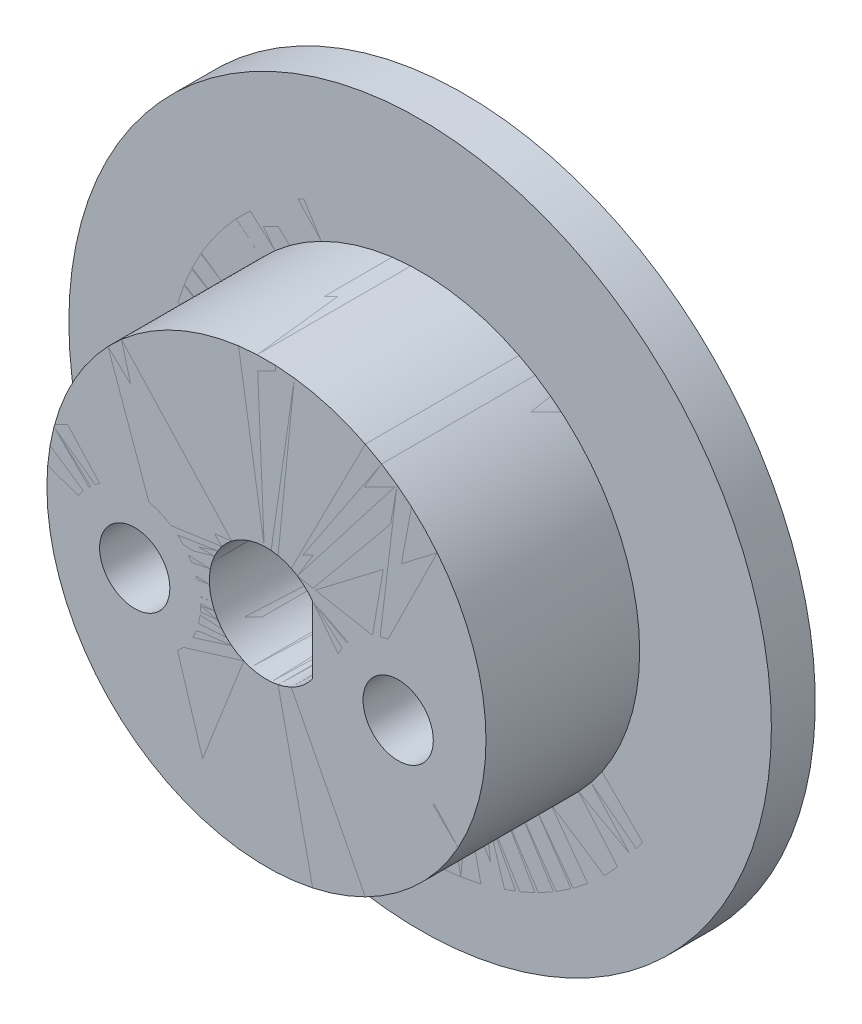
ISO-10303-21;
HEADER;
FILE_DESCRIPTION(('STEP AP214'),'2;1');
FILE_NAME('part.step','',(''),(''),'','','');
FILE_SCHEMA(('AUTOMOTIVE_DESIGN { 1 0 10303 214 1 1 1 1 }'));
ENDSEC;
DATA;
#1=APPLICATION_CONTEXT('core data for automotive mechanical design processes');
#2=APPLICATION_PROTOCOL_DEFINITION('international standard','automotive_design',2000,#1);
#3=PRODUCT_CONTEXT('',#1,'mechanical');
#4=PRODUCT('Part','Part','',(#3));
#5=PRODUCT_RELATED_PRODUCT_CATEGORY('part','',(#4));
#6=PRODUCT_DEFINITION_FORMATION('','',#4);
#7=PRODUCT_DEFINITION_CONTEXT('part definition',#1,'design');
#8=PRODUCT_DEFINITION('design','',#6,#7);
#9=PRODUCT_DEFINITION_SHAPE('','',#8);
#10=(LENGTH_UNIT() NAMED_UNIT(*) SI_UNIT(.MILLI.,.METRE.));
#11=(NAMED_UNIT(*) PLANE_ANGLE_UNIT() SI_UNIT($,.RADIAN.));
#12=(NAMED_UNIT(*) SI_UNIT($,.STERADIAN.) SOLID_ANGLE_UNIT());
#13=UNCERTAINTY_MEASURE_WITH_UNIT(LENGTH_MEASURE(1.E-05),#10,'distance_accuracy_value','');
#14=(GEOMETRIC_REPRESENTATION_CONTEXT(3) GLOBAL_UNCERTAINTY_ASSIGNED_CONTEXT((#13)) GLOBAL_UNIT_ASSIGNED_CONTEXT((#10,
#11,#12)) REPRESENTATION_CONTEXT('',''));
#15=CARTESIAN_POINT('',(0.,0.,0.));
#16=DIRECTION('',(0.,0.,1.));
#17=DIRECTION('',(1.,0.,0.));
#18=AXIS2_PLACEMENT_3D('',#15,#16,#17);
#19=CARTESIAN_POINT('',(0.,0.,18.));
#20=DIRECTION('',(0.,0.,1.));
#21=DIRECTION('',(1.,0.,0.));
#22=AXIS2_PLACEMENT_3D('',#19,#20,#21);
#23=PLANE('',#22);
#24=CARTESIAN_POINT('',(6.,-1.21,18.));
#25=DIRECTION('',(0.,0.,1.));
#26=DIRECTION('',(1.,0.,0.));
#27=AXIS2_PLACEMENT_3D('',#24,#25,#26);
#28=CIRCLE('',#27,3.);
#29=CARTESIAN_POINT('',(9.,-1.21,18.));
#30=VERTEX_POINT('',#29);
#31=EDGE_CURVE('P0_E55',#30,#30,#28,.F.);
#32=ORIENTED_EDGE('',*,*,#31,.T.);
#33=EDGE_LOOP('',(#32));
#34=FACE_BOUND('',#33,.T.);
#35=CARTESIAN_POINT('',(-6.,-1.21,18.));
#36=DIRECTION('',(0.,0.,1.));
#37=DIRECTION('',(1.,0.,0.));
#38=AXIS2_PLACEMENT_3D('',#35,#36,#37);
#39=CIRCLE('',#38,3.);
#40=CARTESIAN_POINT('',(-3.,-1.21,18.));
#41=VERTEX_POINT('',#40);
#42=EDGE_CURVE('P0_E122',#41,#41,#39,.F.);
#43=ORIENTED_EDGE('',*,*,#42,.T.);
#44=EDGE_LOOP('',(#43));
#45=FACE_BOUND('',#44,.T.);
#46=CARTESIAN_POINT('',(-1.59872115546023E-13,-2.8421709430404E-13,18.));
#47=DIRECTION('',(0.,0.,-1.));
#48=DIRECTION('',(-1.,0.,0.));
#49=AXIS2_PLACEMENT_3D('',#46,#47,#48);
#50=CIRCLE('',#49,2.6);
#51=CARTESIAN_POINT('',(2.09999999999983,-1.53297097167589,18.));
#52=VERTEX_POINT('',#51);
#53=CARTESIAN_POINT('',(2.09999999999983,1.53297097167532,18.));
#54=VERTEX_POINT('',#53);
#55=EDGE_CURVE('P0_E85',#52,#54,#50,.T.);
#56=ORIENTED_EDGE('',*,*,#55,.T.);
#57=DIRECTION('',(0.,1.,0.));
#58=VECTOR('',#57,1.);
#59=CARTESIAN_POINT('',(2.09999999999983,0.,18.));
#60=LINE('',#59,#58);
#61=EDGE_CURVE('P0_E93',#54,#52,#60,.F.);
#62=ORIENTED_EDGE('',*,*,#61,.T.);
#63=EDGE_LOOP('',(#56,#62));
#64=FACE_BOUND('',#63,.T.);
#65=CARTESIAN_POINT('',(0.,0.,18.));
#66=DIRECTION('',(0.,0.,1.));
#67=DIRECTION('',(-1.,0.,0.));
#68=AXIS2_PLACEMENT_3D('',#65,#66,#67);
#69=CIRCLE('',#68,10.);
#70=CARTESIAN_POINT('',(10.,0.,18.));
#71=VERTEX_POINT('',#70);
#72=EDGE_CURVE('P0_E153',#71,#71,#69,.T.);
#73=ORIENTED_EDGE('',*,*,#72,.T.);
#74=EDGE_LOOP('',(#73));
#75=FACE_BOUND('',#74,.T.);
#76=ADVANCED_FACE('P0_F45',(#34,#45,#64,#75),#23,.T.);
#77=CARTESIAN_POINT('',(0.,0.,11.));
#78=DIRECTION('',(0.,0.,1.));
#79=DIRECTION('',(-1.,0.,0.));
#80=AXIS2_PLACEMENT_3D('',#77,#78,#79);
#81=CYLINDRICAL_SURFACE('',#80,10.);
#82=ORIENTED_EDGE('',*,*,#72,.F.);
#83=DIRECTION('',(0.,0.,-1.));
#84=VECTOR('',#83,1.);
#85=CARTESIAN_POINT('',(10.,0.,11.));
#86=LINE('',#85,#84);
#87=CARTESIAN_POINT('',(10.,0.,11.));
#88=VERTEX_POINT('',#87);
#89=EDGE_CURVE('P0_E67',#71,#88,#86,.T.);
#90=ORIENTED_EDGE('',*,*,#89,.T.);
#91=CARTESIAN_POINT('',(0.,0.,11.));
#92=DIRECTION('',(0.,0.,-1.));
#93=DIRECTION('',(-1.,0.,0.));
#94=AXIS2_PLACEMENT_3D('',#91,#92,#93);
#95=CIRCLE('',#94,10.);
#96=EDGE_CURVE('P0_E96',#88,#88,#95,.T.);
#97=ORIENTED_EDGE('',*,*,#96,.F.);
#98=ORIENTED_EDGE('',*,*,#89,.F.);
#99=EDGE_LOOP('',(#82,#90,#97,#98));
#100=FACE_BOUND('',#99,.T.);
#101=ADVANCED_FACE('P0_F163',(#100),#81,.T.);
#102=CARTESIAN_POINT('',(0.,0.,9.));
#103=DIRECTION('',(0.,0.,1.));
#104=DIRECTION('',(1.,0.,0.));
#105=AXIS2_PLACEMENT_3D('',#102,#103,#104);
#106=PLANE('',#105);
#107=CARTESIAN_POINT('',(-6.,-1.21,9.));
#108=DIRECTION('',(0.,0.,1.));
#109=DIRECTION('',(1.,0.,0.));
#110=AXIS2_PLACEMENT_3D('',#107,#108,#109);
#111=CIRCLE('',#110,2.);
#112=CARTESIAN_POINT('',(-4.,-1.21,9.));
#113=VERTEX_POINT('',#112);
#114=EDGE_CURVE('P0_E143',#113,#113,#111,.T.);
#115=ORIENTED_EDGE('',*,*,#114,.T.);
#116=EDGE_LOOP('',(#115));
#117=FACE_BOUND('',#116,.T.);
#118=CARTESIAN_POINT('',(6.,-1.21,9.));
#119=DIRECTION('',(0.,0.,1.));
#120=DIRECTION('',(1.,0.,0.));
#121=AXIS2_PLACEMENT_3D('',#118,#119,#120);
#122=CIRCLE('',#121,2.);
#123=CARTESIAN_POINT('',(8.,-1.21,9.));
#124=VERTEX_POINT('',#123);
#125=EDGE_CURVE('P0_E141',#124,#124,#122,.T.);
#126=ORIENTED_EDGE('',*,*,#125,.T.);
#127=EDGE_LOOP('',(#126));
#128=FACE_BOUND('',#127,.T.);
#129=CARTESIAN_POINT('',(-1.5487611193521E-13,-2.81469292318093E-13,9.));
#130=DIRECTION('',(0.,0.,1.));
#131=DIRECTION('',(-1.,0.,0.));
#132=AXIS2_PLACEMENT_3D('',#129,#130,#131);
#133=CIRCLE('',#132,2.6);
#134=CARTESIAN_POINT('',(2.09999999999984,1.53297097167533,9.));
#135=VERTEX_POINT('',#134);
#136=CARTESIAN_POINT('',(2.09999999999984,-1.5329709716759,9.));
#137=VERTEX_POINT('',#136);
#138=EDGE_CURVE('P0_E97',#135,#137,#133,.T.);
#139=ORIENTED_EDGE('',*,*,#138,.T.);
#140=DIRECTION('',(0.,1.,0.));
#141=VECTOR('',#140,1.);
#142=CARTESIAN_POINT('',(2.09999999999984,0.766485485837665,9.));
#143=LINE('',#142,#141);
#144=EDGE_CURVE('P0_E116',#137,#135,#143,.T.);
#145=ORIENTED_EDGE('',*,*,#144,.T.);
#146=EDGE_LOOP('',(#139,#145));
#147=FACE_BOUND('',#146,.T.);
#148=CARTESIAN_POINT('',(0.,0.,9.));
#149=DIRECTION('',(0.,0.,-1.));
#150=DIRECTION('',(-1.,0.,0.));
#151=AXIS2_PLACEMENT_3D('',#148,#149,#150);
#152=CIRCLE('',#151,16.);
#153=CARTESIAN_POINT('',(-16.,0.,9.));
#154=VERTEX_POINT('',#153);
#155=EDGE_CURVE('P0_E144',#154,#154,#152,.T.);
#156=ORIENTED_EDGE('',*,*,#155,.T.);
#157=EDGE_LOOP('',(#156));
#158=FACE_BOUND('',#157,.T.);
#159=ADVANCED_FACE('P0_F168',(#117,#128,#147,#158),#106,.F.);
#160=CARTESIAN_POINT('',(0.,0.,11.));
#161=DIRECTION('',(0.,0.,1.));
#162=DIRECTION('',(1.,0.,0.));
#163=AXIS2_PLACEMENT_3D('',#160,#161,#162);
#164=PLANE('',#163);
#165=ORIENTED_EDGE('',*,*,#96,.T.);
#166=EDGE_LOOP('',(#165));
#167=FACE_BOUND('',#166,.T.);
#168=CARTESIAN_POINT('',(0.,0.,11.));
#169=DIRECTION('',(0.,0.,1.));
#170=DIRECTION('',(1.,0.,0.));
#171=AXIS2_PLACEMENT_3D('',#168,#169,#170);
#172=CIRCLE('',#171,16.);
#173=CARTESIAN_POINT('',(16.,0.,11.));
#174=VERTEX_POINT('',#173);
#175=EDGE_CURVE('P0_E149',#174,#174,#172,.F.);
#176=ORIENTED_EDGE('',*,*,#175,.F.);
#177=EDGE_LOOP('',(#176));
#178=FACE_BOUND('',#177,.T.);
#179=ADVANCED_FACE('P0_F165',(#167,#178),#164,.T.);
#180=CARTESIAN_POINT('',(-1.59872115546023E-13,-2.8421709430404E-13,17.9999999999996));
#181=DIRECTION('',(0.,0.,-1.));
#182=DIRECTION('',(-1.,0.,0.));
#183=AXIS2_PLACEMENT_3D('',#180,#181,#182);
#184=CYLINDRICAL_SURFACE('',#183,2.6);
#185=DIRECTION('',(0.,0.,-1.));
#186=VECTOR('',#185,1.);
#187=CARTESIAN_POINT('',(2.09999999999983,-1.5329709716759,17.9999999999996));
#188=LINE('',#187,#186);
#189=EDGE_CURVE('P0_E109',#52,#137,#188,.T.);
#190=ORIENTED_EDGE('',*,*,#189,.T.);
#191=ORIENTED_EDGE('',*,*,#138,.F.);
#192=DIRECTION('',(0.,0.,-1.));
#193=VECTOR('',#192,1.);
#194=CARTESIAN_POINT('',(2.09999999999983,1.53297097167533,17.9999999999996));
#195=LINE('',#194,#193);
#196=EDGE_CURVE('P0_E100',#54,#135,#195,.T.);
#197=ORIENTED_EDGE('',*,*,#196,.F.);
#198=ORIENTED_EDGE('',*,*,#55,.F.);
#199=EDGE_LOOP('',(#190,#191,#197,#198));
#200=FACE_BOUND('',#199,.T.);
#201=ADVANCED_FACE('P0_F101',(#200),#184,.F.);
#202=CARTESIAN_POINT('',(2.09999999999983,1.53297097167533,17.9999999999996));
#203=DIRECTION('',(1.,0.,0.));
#204=DIRECTION('',(0.,0.,1.));
#205=AXIS2_PLACEMENT_3D('',#202,#203,#204);
#206=PLANE('',#205);
#207=ORIENTED_EDGE('',*,*,#196,.T.);
#208=ORIENTED_EDGE('',*,*,#144,.F.);
#209=ORIENTED_EDGE('',*,*,#189,.F.);
#210=ORIENTED_EDGE('',*,*,#61,.F.);
#211=EDGE_LOOP('',(#207,#208,#209,#210));
#212=FACE_BOUND('',#211,.T.);
#213=ADVANCED_FACE('P0_F108',(#212),#206,.F.);
#214=CARTESIAN_POINT('',(6.,-1.21,9.));
#215=DIRECTION('',(0.,0.,1.));
#216=DIRECTION('',(1.,0.,0.));
#217=AXIS2_PLACEMENT_3D('',#214,#215,#216);
#218=CYLINDRICAL_SURFACE('',#217,2.);
#219=CARTESIAN_POINT('',(6.,-1.21,17.));
#220=DIRECTION('',(0.,0.,1.));
#221=DIRECTION('',(1.,0.,0.));
#222=AXIS2_PLACEMENT_3D('',#219,#220,#221);
#223=CIRCLE('',#222,2.);
#224=CARTESIAN_POINT('',(8.,-1.21,17.));
#225=VERTEX_POINT('',#224);
#226=EDGE_CURVE('P0_E119',#225,#225,#223,.T.);
#227=ORIENTED_EDGE('',*,*,#226,.T.);
#228=EDGE_LOOP('',(#227));
#229=FACE_BOUND('',#228,.T.);
#230=ORIENTED_EDGE('',*,*,#125,.F.);
#231=EDGE_LOOP('',(#230));
#232=FACE_BOUND('',#231,.T.);
#233=ADVANCED_FACE('P0_F135',(#229,#232),#218,.F.);
#234=CARTESIAN_POINT('',(-6.,-1.21,9.));
#235=DIRECTION('',(0.,0.,1.));
#236=DIRECTION('',(1.,0.,0.));
#237=AXIS2_PLACEMENT_3D('',#234,#235,#236);
#238=CYLINDRICAL_SURFACE('',#237,2.);
#239=CARTESIAN_POINT('',(-6.,-1.21,17.));
#240=DIRECTION('',(0.,0.,1.));
#241=DIRECTION('',(1.,0.,0.));
#242=AXIS2_PLACEMENT_3D('',#239,#240,#241);
#243=CIRCLE('',#242,2.);
#244=CARTESIAN_POINT('',(-4.,-1.21,17.));
#245=VERTEX_POINT('',#244);
#246=EDGE_CURVE('P0_E11',#245,#245,#243,.T.);
#247=ORIENTED_EDGE('',*,*,#246,.T.);
#248=EDGE_LOOP('',(#247));
#249=FACE_BOUND('',#248,.T.);
#250=ORIENTED_EDGE('',*,*,#114,.F.);
#251=EDGE_LOOP('',(#250));
#252=FACE_BOUND('',#251,.T.);
#253=ADVANCED_FACE('P0_F132',(#249,#252),#238,.F.);
#254=CARTESIAN_POINT('',(6.,-1.21,17.));
#255=DIRECTION('',(0.,0.,1.));
#256=DIRECTION('',(1.,0.,0.));
#257=AXIS2_PLACEMENT_3D('',#254,#255,#256);
#258=CONICAL_SURFACE('',#257,2.,0.785398163397449);
#259=ORIENTED_EDGE('',*,*,#31,.F.);
#260=EDGE_LOOP('',(#259));
#261=FACE_BOUND('',#260,.T.);
#262=ORIENTED_EDGE('',*,*,#226,.F.);
#263=EDGE_LOOP('',(#262));
#264=FACE_BOUND('',#263,.T.);
#265=ADVANCED_FACE('P0_F129',(#261,#264),#258,.F.);
#266=CARTESIAN_POINT('',(-6.,-1.21,17.));
#267=DIRECTION('',(0.,0.,1.));
#268=DIRECTION('',(1.,0.,0.));
#269=AXIS2_PLACEMENT_3D('',#266,#267,#268);
#270=CONICAL_SURFACE('',#269,2.,0.785398163397451);
#271=ORIENTED_EDGE('',*,*,#42,.F.);
#272=EDGE_LOOP('',(#271));
#273=FACE_BOUND('',#272,.T.);
#274=ORIENTED_EDGE('',*,*,#246,.F.);
#275=EDGE_LOOP('',(#274));
#276=FACE_BOUND('',#275,.T.);
#277=ADVANCED_FACE('P0_F48',(#273,#276),#270,.F.);
#278=CARTESIAN_POINT('',(0.,0.,56.254833995939));
#279=DIRECTION('',(0.,0.,-1.));
#280=DIRECTION('',(-1.,0.,0.));
#281=AXIS2_PLACEMENT_3D('',#278,#279,#280);
#282=CYLINDRICAL_SURFACE('',#281,16.);
#283=ORIENTED_EDGE('',*,*,#155,.F.);
#284=EDGE_LOOP('',(#283));
#285=FACE_BOUND('',#284,.T.);
#286=ORIENTED_EDGE('',*,*,#175,.T.);
#287=EDGE_LOOP('',(#286));
#288=FACE_BOUND('',#287,.T.);
#289=ADVANCED_FACE('P0_F173',(#285,#288),#282,.T.);
#290=CLOSED_SHELL('',(#76,#101,#159,#179,#201,#213,#233,#253,#265,#277,#289));
#291=MANIFOLD_SOLID_BREP('P0_B2',#290);
#292=CARTESIAN_POINT('',(0.,0.,18.));
#293=DIRECTION('',(0.,0.,1.));
#294=DIRECTION('',(1.,0.,0.));
#295=AXIS2_PLACEMENT_3D('',#292,#293,#294);
#296=PLANE('',#295);
#297=CARTESIAN_POINT('',(-6.,-1.21,18.));
#298=DIRECTION('',(0.,0.,-1.));
#299=DIRECTION('',(-1.,0.,0.));
#300=AXIS2_PLACEMENT_3D('',#297,#298,#299);
#301=CIRCLE('',#300,1.6);
#302=CARTESIAN_POINT('',(-4.4,-1.21,18.));
#303=VERTEX_POINT('',#302);
#304=EDGE_CURVE('P1_E19',#303,#303,#301,.T.);
#305=ORIENTED_EDGE('',*,*,#304,.T.);
#306=EDGE_LOOP('',(#305));
#307=FACE_BOUND('',#306,.T.);
#308=CARTESIAN_POINT('',(6.,-1.21,18.));
#309=DIRECTION('',(0.,0.,-1.));
#310=DIRECTION('',(-1.,0.,0.));
#311=AXIS2_PLACEMENT_3D('',#308,#309,#310);
#312=CIRCLE('',#311,1.6);
#313=CARTESIAN_POINT('',(7.6,-1.21,18.));
#314=VERTEX_POINT('',#313);
#315=EDGE_CURVE('P1_E151',#314,#314,#312,.T.);
#316=ORIENTED_EDGE('',*,*,#315,.T.);
#317=EDGE_LOOP('',(#316));
#318=FACE_BOUND('',#317,.T.);
#319=CARTESIAN_POINT('',(-1.59872115546023E-13,-2.8421709430404E-13,18.));
#320=DIRECTION('',(0.,0.,-1.));
#321=DIRECTION('',(-1.,0.,0.));
#322=AXIS2_PLACEMENT_3D('',#319,#320,#321);
#323=CIRCLE('',#322,2.6);
#324=CARTESIAN_POINT('',(2.09999999999983,-1.5329709716759,17.9999999999996));
#325=VERTEX_POINT('',#324);
#326=CARTESIAN_POINT('',(2.09999999999983,1.53297097167533,17.9999999999996));
#327=VERTEX_POINT('',#326);
#328=EDGE_CURVE('P1_E98',#325,#327,#323,.T.);
#329=ORIENTED_EDGE('',*,*,#328,.T.);
#330=DIRECTION('',(0.,-1.,0.));
#331=VECTOR('',#330,1.);
#332=CARTESIAN_POINT('',(2.09999999999983,0.766485485837665,18.));
#333=LINE('',#332,#331);
#334=EDGE_CURVE('P1_E112',#327,#325,#333,.T.);
#335=ORIENTED_EDGE('',*,*,#334,.T.);
#336=EDGE_LOOP('',(#329,#335));
#337=FACE_BOUND('',#336,.T.);
#338=CARTESIAN_POINT('',(0.,0.,18.));
#339=DIRECTION('',(0.,0.,1.));
#340=DIRECTION('',(-1.,0.,0.));
#341=AXIS2_PLACEMENT_3D('',#338,#339,#340);
#342=CIRCLE('',#341,10.);
#343=CARTESIAN_POINT('',(10.,0.,18.));
#344=VERTEX_POINT('',#343);
#345=EDGE_CURVE('P1_E26',#344,#344,#342,.T.);
#346=ORIENTED_EDGE('',*,*,#345,.T.);
#347=EDGE_LOOP('',(#346));
#348=FACE_BOUND('',#347,.T.);
#349=ADVANCED_FACE('P1_F16',(#307,#318,#337,#348),#296,.T.);
#350=CARTESIAN_POINT('',(0.,0.,11.));
#351=DIRECTION('',(0.,0.,1.));
#352=DIRECTION('',(-1.,0.,0.));
#353=AXIS2_PLACEMENT_3D('',#350,#351,#352);
#354=CYLINDRICAL_SURFACE('',#353,10.);
#355=ORIENTED_EDGE('',*,*,#345,.F.);
#356=DIRECTION('',(0.,0.,-1.));
#357=VECTOR('',#356,1.);
#358=CARTESIAN_POINT('',(10.,0.,11.));
#359=LINE('',#358,#357);
#360=CARTESIAN_POINT('',(10.,0.,11.));
#361=VERTEX_POINT('',#360);
#362=EDGE_CURVE('P1_E11',#344,#361,#359,.T.);
#363=ORIENTED_EDGE('',*,*,#362,.T.);
#364=CARTESIAN_POINT('',(0.,0.,11.));
#365=DIRECTION('',(0.,0.,-1.));
#366=DIRECTION('',(-1.,0.,0.));
#367=AXIS2_PLACEMENT_3D('',#364,#365,#366);
#368=CIRCLE('',#367,10.);
#369=EDGE_CURVE('P1_E138',#361,#361,#368,.T.);
#370=ORIENTED_EDGE('',*,*,#369,.F.);
#371=ORIENTED_EDGE('',*,*,#362,.F.);
#372=EDGE_LOOP('',(#355,#363,#370,#371));
#373=FACE_BOUND('',#372,.T.);
#374=ADVANCED_FACE('P1_F203',(#373),#354,.T.);
#375=CARTESIAN_POINT('',(0.,0.,9.));
#376=DIRECTION('',(0.,0.,1.));
#377=DIRECTION('',(1.,0.,0.));
#378=AXIS2_PLACEMENT_3D('',#375,#376,#377);
#379=PLANE('',#378);
#380=CARTESIAN_POINT('',(-6.,-1.21,9.));
#381=DIRECTION('',(0.,0.,1.));
#382=DIRECTION('',(-1.,0.,0.));
#383=AXIS2_PLACEMENT_3D('',#380,#381,#382);
#384=CIRCLE('',#383,1.6);
#385=CARTESIAN_POINT('',(-4.4,-1.21,9.));
#386=VERTEX_POINT('',#385);
#387=EDGE_CURVE('P1_E156',#386,#386,#384,.T.);
#388=ORIENTED_EDGE('',*,*,#387,.T.);
#389=EDGE_LOOP('',(#388));
#390=FACE_BOUND('',#389,.T.);
#391=CARTESIAN_POINT('',(6.,-1.21,9.));
#392=DIRECTION('',(0.,0.,1.));
#393=DIRECTION('',(-1.,0.,0.));
#394=AXIS2_PLACEMENT_3D('',#391,#392,#393);
#395=CIRCLE('',#394,1.6);
#396=CARTESIAN_POINT('',(7.6,-1.21,9.));
#397=VERTEX_POINT('',#396);
#398=EDGE_CURVE('P1_E109',#397,#397,#395,.T.);
#399=ORIENTED_EDGE('',*,*,#398,.T.);
#400=EDGE_LOOP('',(#399));
#401=FACE_BOUND('',#400,.T.);
#402=CARTESIAN_POINT('',(-1.5487611193521E-13,-2.81469292318093E-13,9.));
#403=DIRECTION('',(0.,0.,1.));
#404=DIRECTION('',(-1.,0.,0.));
#405=AXIS2_PLACEMENT_3D('',#402,#403,#404);
#406=CIRCLE('',#405,2.6);
#407=CARTESIAN_POINT('',(2.09999999999984,1.53297097167533,9.));
#408=VERTEX_POINT('',#407);
#409=CARTESIAN_POINT('',(2.09999999999984,-1.5329709716759,9.));
#410=VERTEX_POINT('',#409);
#411=EDGE_CURVE('P1_E110',#408,#410,#406,.T.);
#412=ORIENTED_EDGE('',*,*,#411,.T.);
#413=DIRECTION('',(0.,1.,0.));
#414=VECTOR('',#413,1.);
#415=CARTESIAN_POINT('',(2.09999999999984,0.766485485837665,9.));
#416=LINE('',#415,#414);
#417=EDGE_CURVE('P1_E119',#410,#408,#416,.T.);
#418=ORIENTED_EDGE('',*,*,#417,.T.);
#419=EDGE_LOOP('',(#412,#418));
#420=FACE_BOUND('',#419,.T.);
#421=CARTESIAN_POINT('',(0.,0.,9.));
#422=DIRECTION('',(0.,0.,-1.));
#423=DIRECTION('',(-1.,0.,0.));
#424=AXIS2_PLACEMENT_3D('',#421,#422,#423);
#425=CIRCLE('',#424,11.5);
#426=CARTESIAN_POINT('',(-11.0242322682793,3.27357646848657,9.));
#427=VERTEX_POINT('',#426);
#428=CARTESIAN_POINT('',(11.0242322682793,3.27357646848657,9.));
#429=VERTEX_POINT('',#428);
#430=EDGE_CURVE('P1_E90',#427,#429,#425,.T.);
#431=ORIENTED_EDGE('',*,*,#430,.T.);
#432=CARTESIAN_POINT('',(0.,-1.21,9.));
#433=DIRECTION('',(0.,0.,1.));
#434=DIRECTION('',(-1.,0.,0.));
#435=AXIS2_PLACEMENT_3D('',#432,#433,#434);
#436=CIRCLE('',#435,11.9010989010989);
#437=EDGE_CURVE('P1_E131',#427,#429,#436,.T.);
#438=ORIENTED_EDGE('',*,*,#437,.F.);
#439=EDGE_LOOP('',(#431,#438));
#440=FACE_BOUND('',#439,.T.);
#441=ADVANCED_FACE('P1_F173',(#390,#401,#420,#440),#379,.F.);
#442=CARTESIAN_POINT('',(0.,0.,9.));
#443=DIRECTION('',(0.,0.,1.));
#444=DIRECTION('',(-1.,0.,0.));
#445=AXIS2_PLACEMENT_3D('',#442,#443,#444);
#446=CYLINDRICAL_SURFACE('',#445,11.5);
#447=DIRECTION('',(0.,0.,1.));
#448=VECTOR('',#447,1.);
#449=CARTESIAN_POINT('',(-11.0242322682793,3.27357646848657,9.));
#450=LINE('',#449,#448);
#451=CARTESIAN_POINT('',(-11.0242322682793,3.27357646848657,11.));
#452=VERTEX_POINT('',#451);
#453=EDGE_CURVE('P1_E127',#427,#452,#450,.T.);
#454=ORIENTED_EDGE('',*,*,#453,.T.);
#455=CARTESIAN_POINT('',(0.,0.,11.));
#456=DIRECTION('',(0.,0.,1.));
#457=DIRECTION('',(-1.,0.,0.));
#458=AXIS2_PLACEMENT_3D('',#455,#456,#457);
#459=CIRCLE('',#458,11.5);
#460=CARTESIAN_POINT('',(11.0242322682793,3.27357646848657,11.));
#461=VERTEX_POINT('',#460);
#462=EDGE_CURVE('P1_E80',#461,#452,#459,.T.);
#463=ORIENTED_EDGE('',*,*,#462,.F.);
#464=DIRECTION('',(0.,0.,-1.));
#465=VECTOR('',#464,1.);
#466=CARTESIAN_POINT('',(11.0242322682793,3.27357646848657,9.));
#467=LINE('',#466,#465);
#468=EDGE_CURVE('P1_E135',#461,#429,#467,.T.);
#469=ORIENTED_EDGE('',*,*,#468,.T.);
#470=ORIENTED_EDGE('',*,*,#430,.F.);
#471=EDGE_LOOP('',(#454,#463,#469,#470));
#472=FACE_BOUND('',#471,.T.);
#473=ADVANCED_FACE('P1_F185',(#472),#446,.T.);
#474=CARTESIAN_POINT('',(0.,0.,11.));
#475=DIRECTION('',(0.,0.,1.));
#476=DIRECTION('',(1.,0.,0.));
#477=AXIS2_PLACEMENT_3D('',#474,#475,#476);
#478=PLANE('',#477);
#479=ORIENTED_EDGE('',*,*,#369,.T.);
#480=EDGE_LOOP('',(#479));
#481=FACE_BOUND('',#480,.T.);
#482=ORIENTED_EDGE('',*,*,#462,.T.);
#483=CARTESIAN_POINT('',(0.,-1.21,11.));
#484=DIRECTION('',(0.,0.,1.));
#485=DIRECTION('',(-1.,0.,0.));
#486=AXIS2_PLACEMENT_3D('',#483,#484,#485);
#487=CIRCLE('',#486,11.9010989010989);
#488=EDGE_CURVE('P1_E140',#452,#461,#487,.T.);
#489=ORIENTED_EDGE('',*,*,#488,.T.);
#490=EDGE_LOOP('',(#482,#489));
#491=FACE_BOUND('',#490,.T.);
#492=ADVANCED_FACE('P1_F191',(#481,#491),#478,.T.);
#493=CARTESIAN_POINT('',(0.,-1.21,9.));
#494=DIRECTION('',(0.,0.,1.));
#495=DIRECTION('',(0.,-1.,0.));
#496=AXIS2_PLACEMENT_3D('',#493,#494,#495);
#497=CYLINDRICAL_SURFACE('',#496,11.9010989010989);
#498=ORIENTED_EDGE('',*,*,#453,.F.);
#499=ORIENTED_EDGE('',*,*,#437,.T.);
#500=ORIENTED_EDGE('',*,*,#468,.F.);
#501=ORIENTED_EDGE('',*,*,#488,.F.);
#502=EDGE_LOOP('',(#498,#499,#500,#501));
#503=FACE_BOUND('',#502,.T.);
#504=ADVANCED_FACE('P1_F188',(#503),#497,.T.);
#505=CARTESIAN_POINT('',(-6.,-1.21,9.));
#506=DIRECTION('',(0.,0.,1.));
#507=DIRECTION('',(-1.,0.,0.));
#508=AXIS2_PLACEMENT_3D('',#505,#506,#507);
#509=CYLINDRICAL_SURFACE('',#508,1.6);
#510=ORIENTED_EDGE('',*,*,#387,.F.);
#511=DIRECTION('',(0.,0.,1.));
#512=VECTOR('',#511,1.);
#513=CARTESIAN_POINT('',(-4.4,-1.21,9.));
#514=LINE('',#513,#512);
#515=EDGE_CURVE('P1_E152',#386,#303,#514,.T.);
#516=ORIENTED_EDGE('',*,*,#515,.T.);
#517=ORIENTED_EDGE('',*,*,#304,.F.);
#518=ORIENTED_EDGE('',*,*,#515,.F.);
#519=EDGE_LOOP('',(#510,#516,#517,#518));
#520=FACE_BOUND('',#519,.T.);
#521=ADVANCED_FACE('P1_F177',(#520),#509,.F.);
#522=CARTESIAN_POINT('',(6.,-1.21,9.));
#523=DIRECTION('',(0.,0.,1.));
#524=DIRECTION('',(-1.,0.,0.));
#525=AXIS2_PLACEMENT_3D('',#522,#523,#524);
#526=CYLINDRICAL_SURFACE('',#525,1.6);
#527=ORIENTED_EDGE('',*,*,#398,.F.);
#528=DIRECTION('',(0.,0.,1.));
#529=VECTOR('',#528,1.);
#530=CARTESIAN_POINT('',(7.6,-1.21,9.));
#531=LINE('',#530,#529);
#532=EDGE_CURVE('P1_E145',#397,#314,#531,.T.);
#533=ORIENTED_EDGE('',*,*,#532,.T.);
#534=ORIENTED_EDGE('',*,*,#315,.F.);
#535=ORIENTED_EDGE('',*,*,#532,.F.);
#536=EDGE_LOOP('',(#527,#533,#534,#535));
#537=FACE_BOUND('',#536,.T.);
#538=ADVANCED_FACE('P1_F212',(#537),#526,.F.);
#539=CARTESIAN_POINT('',(-1.59872115546023E-13,-2.8421709430404E-13,17.9999999999996));
#540=DIRECTION('',(0.,0.,-1.));
#541=DIRECTION('',(-1.,0.,0.));
#542=AXIS2_PLACEMENT_3D('',#539,#540,#541);
#543=CYLINDRICAL_SURFACE('',#542,2.6);
#544=ORIENTED_EDGE('',*,*,#411,.F.);
#545=DIRECTION('',(0.,0.,-1.));
#546=VECTOR('',#545,1.);
#547=CARTESIAN_POINT('',(2.09999999999983,1.53297097167533,17.9999999999996));
#548=LINE('',#547,#546);
#549=EDGE_CURVE('P1_E105',#327,#408,#548,.T.);
#550=ORIENTED_EDGE('',*,*,#549,.F.);
#551=ORIENTED_EDGE('',*,*,#328,.F.);
#552=DIRECTION('',(0.,0.,-1.));
#553=VECTOR('',#552,1.);
#554=CARTESIAN_POINT('',(2.09999999999983,-1.5329709716759,17.9999999999996));
#555=LINE('',#554,#553);
#556=EDGE_CURVE('P1_E102',#325,#410,#555,.T.);
#557=ORIENTED_EDGE('',*,*,#556,.T.);
#558=EDGE_LOOP('',(#544,#550,#551,#557));
#559=FACE_BOUND('',#558,.T.);
#560=ADVANCED_FACE('P1_F100',(#559),#543,.F.);
#561=CARTESIAN_POINT('',(2.09999999999983,1.53297097167533,17.9999999999996));
#562=DIRECTION('',(1.,0.,0.));
#563=DIRECTION('',(0.,0.,1.));
#564=AXIS2_PLACEMENT_3D('',#561,#562,#563);
#565=PLANE('',#564);
#566=ORIENTED_EDGE('',*,*,#417,.F.);
#567=ORIENTED_EDGE('',*,*,#556,.F.);
#568=ORIENTED_EDGE('',*,*,#334,.F.);
#569=ORIENTED_EDGE('',*,*,#549,.T.);
#570=EDGE_LOOP('',(#566,#567,#568,#569));
#571=FACE_BOUND('',#570,.T.);
#572=ADVANCED_FACE('P1_F117',(#571),#565,.F.);
#573=CLOSED_SHELL('',(#349,#374,#441,#473,#492,#504,#521,#538,#560,#572));
#574=MANIFOLD_SOLID_BREP('P1_B1',#573);
#575=ADVANCED_BREP_SHAPE_REPRESENTATION('',(#18,#291,#574),#14);
#576=SHAPE_DEFINITION_REPRESENTATION(#9,#575);
ENDSEC;
END-ISO-10303-21;
